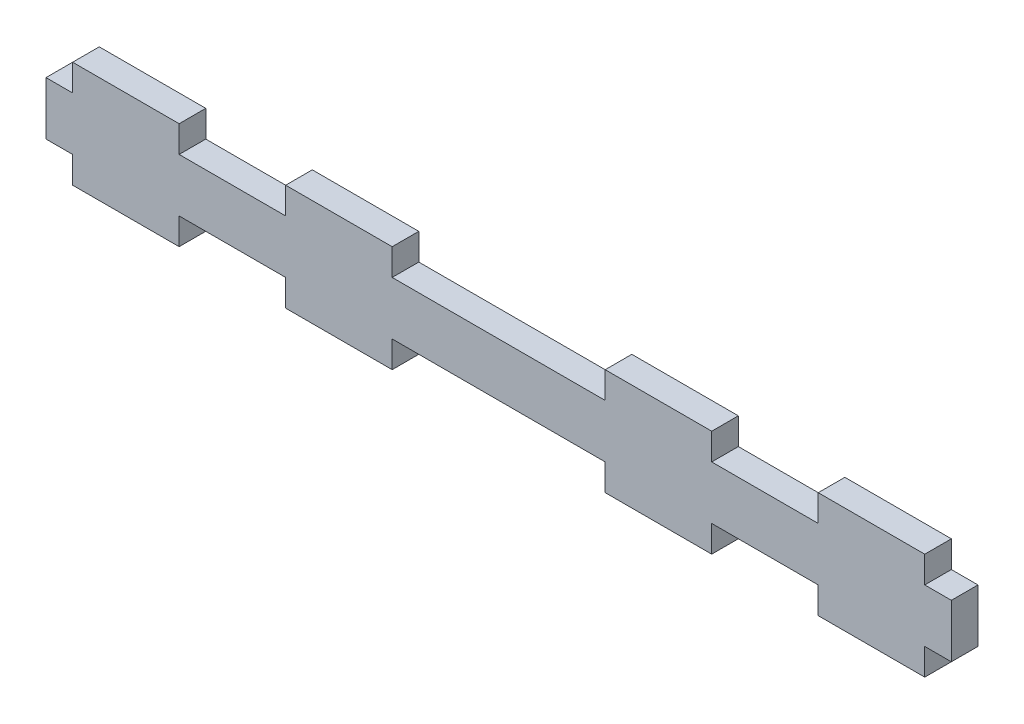
ISO-10303-21;
HEADER;
FILE_DESCRIPTION(('STEP AP214'),'2;1');
FILE_NAME('part.step','',(''),(''),'','','');
FILE_SCHEMA(('AUTOMOTIVE_DESIGN { 1 0 10303 214 1 1 1 1 }'));
ENDSEC;
DATA;
#1=APPLICATION_CONTEXT('core data for automotive mechanical design processes');
#2=APPLICATION_PROTOCOL_DEFINITION('international standard','automotive_design',2000,#1);
#3=PRODUCT_CONTEXT('',#1,'mechanical');
#4=PRODUCT('Part','Part','',(#3));
#5=PRODUCT_RELATED_PRODUCT_CATEGORY('part','',(#4));
#6=PRODUCT_DEFINITION_FORMATION('','',#4);
#7=PRODUCT_DEFINITION_CONTEXT('part definition',#1,'design');
#8=PRODUCT_DEFINITION('design','',#6,#7);
#9=PRODUCT_DEFINITION_SHAPE('','',#8);
#10=(LENGTH_UNIT() NAMED_UNIT(*) SI_UNIT(.MILLI.,.METRE.));
#11=(NAMED_UNIT(*) PLANE_ANGLE_UNIT() SI_UNIT($,.RADIAN.));
#12=(NAMED_UNIT(*) SI_UNIT($,.STERADIAN.) SOLID_ANGLE_UNIT());
#13=UNCERTAINTY_MEASURE_WITH_UNIT(LENGTH_MEASURE(1.E-05),#10,'distance_accuracy_value','');
#14=(GEOMETRIC_REPRESENTATION_CONTEXT(3) GLOBAL_UNCERTAINTY_ASSIGNED_CONTEXT((#13)) GLOBAL_UNIT_ASSIGNED_CONTEXT((#10,
#11,#12)) REPRESENTATION_CONTEXT('',''));
#15=CARTESIAN_POINT('',(0.,0.,0.));
#16=DIRECTION('',(0.,0.,1.));
#17=DIRECTION('',(1.,0.,0.));
#18=AXIS2_PLACEMENT_3D('',#15,#16,#17);
#19=CARTESIAN_POINT('',(42.5000000000001,2.5,2.5));
#20=DIRECTION('',(0.,-1.,0.));
#21=DIRECTION('',(0.,0.,-1.));
#22=AXIS2_PLACEMENT_3D('',#19,#20,#21);
#23=PLANE('',#22);
#24=DIRECTION('',(-1.,0.,0.));
#25=VECTOR('',#24,1.);
#26=CARTESIAN_POINT('',(42.5000000000001,2.5,0.));
#27=LINE('',#26,#25);
#28=CARTESIAN_POINT('',(42.5000000000001,2.5,0.));
#29=VERTEX_POINT('',#28);
#30=CARTESIAN_POINT('',(39.9999999999999,2.5,0.));
#31=VERTEX_POINT('',#30);
#32=EDGE_CURVE('E297',#29,#31,#27,.T.);
#33=ORIENTED_EDGE('',*,*,#32,.T.);
#34=DIRECTION('',(0.,0.,-1.));
#35=VECTOR('',#34,1.);
#36=CARTESIAN_POINT('',(39.9999999999999,2.5,2.5));
#37=LINE('',#36,#35);
#38=CARTESIAN_POINT('',(39.9999999999999,2.5,2.5));
#39=VERTEX_POINT('',#38);
#40=EDGE_CURVE('E11',#39,#31,#37,.T.);
#41=ORIENTED_EDGE('',*,*,#40,.F.);
#42=DIRECTION('',(-1.,0.,0.));
#43=VECTOR('',#42,1.);
#44=CARTESIAN_POINT('',(42.5000000000001,2.5,2.5));
#45=LINE('',#44,#43);
#46=CARTESIAN_POINT('',(42.5000000000001,2.5,2.5));
#47=VERTEX_POINT('',#46);
#48=EDGE_CURVE('E367',#47,#39,#45,.T.);
#49=ORIENTED_EDGE('',*,*,#48,.F.);
#50=DIRECTION('',(0.,0.,-1.));
#51=VECTOR('',#50,1.);
#52=CARTESIAN_POINT('',(42.5000000000001,2.5,2.5));
#53=LINE('',#52,#51);
#54=EDGE_CURVE('E293',#47,#29,#53,.T.);
#55=ORIENTED_EDGE('',*,*,#54,.T.);
#56=EDGE_LOOP('',(#33,#41,#49,#55));
#57=FACE_BOUND('',#56,.T.);
#58=ADVANCED_FACE('F33',(#57),#23,.F.);
#59=CARTESIAN_POINT('',(39.9999999999999,2.5,2.5));
#60=DIRECTION('',(-1.,0.,0.));
#61=DIRECTION('',(0.,-1.,0.));
#62=AXIS2_PLACEMENT_3D('',#59,#60,#61);
#63=PLANE('',#62);
#64=DIRECTION('',(0.,1.,0.));
#65=VECTOR('',#64,1.);
#66=CARTESIAN_POINT('',(39.9999999999999,2.5,0.));
#67=LINE('',#66,#65);
#68=CARTESIAN_POINT('',(40.0000000000001,5.,0.));
#69=VERTEX_POINT('',#68);
#70=EDGE_CURVE('E300',#31,#69,#67,.T.);
#71=ORIENTED_EDGE('',*,*,#70,.T.);
#72=DIRECTION('',(0.,0.,-1.));
#73=VECTOR('',#72,1.);
#74=CARTESIAN_POINT('',(40.0000000000001,5.,2.5));
#75=LINE('',#74,#73);
#76=CARTESIAN_POINT('',(40.0000000000001,5.,2.5));
#77=VERTEX_POINT('',#76);
#78=EDGE_CURVE('E41',#77,#69,#75,.T.);
#79=ORIENTED_EDGE('',*,*,#78,.F.);
#80=DIRECTION('',(0.,1.,0.));
#81=VECTOR('',#80,1.);
#82=CARTESIAN_POINT('',(39.9999999999999,2.5,2.5));
#83=LINE('',#82,#81);
#84=EDGE_CURVE('E176',#39,#77,#83,.T.);
#85=ORIENTED_EDGE('',*,*,#84,.F.);
#86=ORIENTED_EDGE('',*,*,#40,.T.);
#87=EDGE_LOOP('',(#71,#79,#85,#86));
#88=FACE_BOUND('',#87,.T.);
#89=ADVANCED_FACE('F565',(#88),#63,.F.);
#90=CARTESIAN_POINT('',(40.0000000000001,5.,2.5));
#91=DIRECTION('',(0.,-1.,0.));
#92=DIRECTION('',(1.,0.,0.));
#93=AXIS2_PLACEMENT_3D('',#90,#91,#92);
#94=PLANE('',#93);
#95=DIRECTION('',(-1.,0.,0.));
#96=VECTOR('',#95,1.);
#97=CARTESIAN_POINT('',(40.0000000000001,5.,0.));
#98=LINE('',#97,#96);
#99=CARTESIAN_POINT('',(30.0000000000001,5.,0.));
#100=VERTEX_POINT('',#99);
#101=EDGE_CURVE('E302',#69,#100,#98,.T.);
#102=ORIENTED_EDGE('',*,*,#101,.T.);
#103=DIRECTION('',(0.,0.,-1.));
#104=VECTOR('',#103,1.);
#105=CARTESIAN_POINT('',(30.0000000000001,5.,2.5));
#106=LINE('',#105,#104);
#107=CARTESIAN_POINT('',(30.0000000000001,5.,2.5));
#108=VERTEX_POINT('',#107);
#109=EDGE_CURVE('E458',#108,#100,#106,.T.);
#110=ORIENTED_EDGE('',*,*,#109,.F.);
#111=DIRECTION('',(-1.,0.,0.));
#112=VECTOR('',#111,1.);
#113=CARTESIAN_POINT('',(40.0000000000001,5.,2.5));
#114=LINE('',#113,#112);
#115=EDGE_CURVE('E466',#77,#108,#114,.T.);
#116=ORIENTED_EDGE('',*,*,#115,.F.);
#117=ORIENTED_EDGE('',*,*,#78,.T.);
#118=EDGE_LOOP('',(#102,#110,#116,#117));
#119=FACE_BOUND('',#118,.T.);
#120=ADVANCED_FACE('F464',(#119),#94,.F.);
#121=CARTESIAN_POINT('',(30.0000000000001,5.,2.5));
#122=DIRECTION('',(1.,0.,0.));
#123=DIRECTION('',(0.,0.,-1.));
#124=AXIS2_PLACEMENT_3D('',#121,#122,#123);
#125=PLANE('',#124);
#126=DIRECTION('',(0.,-1.,0.));
#127=VECTOR('',#126,1.);
#128=CARTESIAN_POINT('',(30.0000000000001,5.,0.));
#129=LINE('',#128,#127);
#130=CARTESIAN_POINT('',(30.0000000000001,2.5,0.));
#131=VERTEX_POINT('',#130);
#132=EDGE_CURVE('E304',#100,#131,#129,.T.);
#133=ORIENTED_EDGE('',*,*,#132,.T.);
#134=DIRECTION('',(0.,0.,-1.));
#135=VECTOR('',#134,1.);
#136=CARTESIAN_POINT('',(30.0000000000001,2.5,2.5));
#137=LINE('',#136,#135);
#138=CARTESIAN_POINT('',(30.0000000000001,2.5,2.5));
#139=VERTEX_POINT('',#138);
#140=EDGE_CURVE('E455',#139,#131,#137,.T.);
#141=ORIENTED_EDGE('',*,*,#140,.F.);
#142=DIRECTION('',(0.,-1.,0.));
#143=VECTOR('',#142,1.);
#144=CARTESIAN_POINT('',(30.0000000000001,5.,2.5));
#145=LINE('',#144,#143);
#146=EDGE_CURVE('E484',#108,#139,#145,.T.);
#147=ORIENTED_EDGE('',*,*,#146,.F.);
#148=ORIENTED_EDGE('',*,*,#109,.T.);
#149=EDGE_LOOP('',(#133,#141,#147,#148));
#150=FACE_BOUND('',#149,.T.);
#151=ADVANCED_FACE('F475',(#150),#125,.F.);
#152=CARTESIAN_POINT('',(30.0000000000001,2.5,2.5));
#153=DIRECTION('',(0.,-1.,0.));
#154=DIRECTION('',(1.,0.,0.));
#155=AXIS2_PLACEMENT_3D('',#152,#153,#154);
#156=PLANE('',#155);
#157=DIRECTION('',(-1.,0.,0.));
#158=VECTOR('',#157,1.);
#159=CARTESIAN_POINT('',(30.0000000000001,2.5,0.));
#160=LINE('',#159,#158);
#161=CARTESIAN_POINT('',(20.0000000000001,2.5,0.));
#162=VERTEX_POINT('',#161);
#163=EDGE_CURVE('E306',#131,#162,#160,.T.);
#164=ORIENTED_EDGE('',*,*,#163,.T.);
#165=DIRECTION('',(0.,0.,-1.));
#166=VECTOR('',#165,1.);
#167=CARTESIAN_POINT('',(20.0000000000001,2.5,2.5));
#168=LINE('',#167,#166);
#169=CARTESIAN_POINT('',(20.0000000000001,2.5,2.5));
#170=VERTEX_POINT('',#169);
#171=EDGE_CURVE('E452',#170,#162,#168,.T.);
#172=ORIENTED_EDGE('',*,*,#171,.F.);
#173=DIRECTION('',(-1.,0.,0.));
#174=VECTOR('',#173,1.);
#175=CARTESIAN_POINT('',(30.0000000000001,2.5,2.5));
#176=LINE('',#175,#174);
#177=EDGE_CURVE('E481',#139,#170,#176,.T.);
#178=ORIENTED_EDGE('',*,*,#177,.F.);
#179=ORIENTED_EDGE('',*,*,#140,.T.);
#180=EDGE_LOOP('',(#164,#172,#178,#179));
#181=FACE_BOUND('',#180,.T.);
#182=ADVANCED_FACE('F479',(#181),#156,.F.);
#183=CARTESIAN_POINT('',(20.0000000000001,2.5,2.5));
#184=DIRECTION('',(-1.,0.,0.));
#185=DIRECTION('',(0.,0.,1.));
#186=AXIS2_PLACEMENT_3D('',#183,#184,#185);
#187=PLANE('',#186);
#188=DIRECTION('',(0.,1.,0.));
#189=VECTOR('',#188,1.);
#190=CARTESIAN_POINT('',(20.0000000000001,2.5,0.));
#191=LINE('',#190,#189);
#192=CARTESIAN_POINT('',(20.0000000000001,5.,0.));
#193=VERTEX_POINT('',#192);
#194=EDGE_CURVE('E308',#162,#193,#191,.T.);
#195=ORIENTED_EDGE('',*,*,#194,.T.);
#196=DIRECTION('',(0.,0.,-1.));
#197=VECTOR('',#196,1.);
#198=CARTESIAN_POINT('',(20.0000000000001,5.,2.5));
#199=LINE('',#198,#197);
#200=CARTESIAN_POINT('',(20.0000000000001,5.,2.5));
#201=VERTEX_POINT('',#200);
#202=EDGE_CURVE('E449',#201,#193,#199,.T.);
#203=ORIENTED_EDGE('',*,*,#202,.F.);
#204=DIRECTION('',(0.,1.,0.));
#205=VECTOR('',#204,1.);
#206=CARTESIAN_POINT('',(20.0000000000001,2.5,2.5));
#207=LINE('',#206,#205);
#208=EDGE_CURVE('E483',#170,#201,#207,.T.);
#209=ORIENTED_EDGE('',*,*,#208,.F.);
#210=ORIENTED_EDGE('',*,*,#171,.T.);
#211=EDGE_LOOP('',(#195,#203,#209,#210));
#212=FACE_BOUND('',#211,.T.);
#213=ADVANCED_FACE('F578',(#212),#187,.F.);
#214=CARTESIAN_POINT('',(20.0000000000001,5.,2.5));
#215=DIRECTION('',(0.,-1.,0.));
#216=DIRECTION('',(0.,0.,-1.));
#217=AXIS2_PLACEMENT_3D('',#214,#215,#216);
#218=PLANE('',#217);
#219=DIRECTION('',(-1.,0.,0.));
#220=VECTOR('',#219,1.);
#221=CARTESIAN_POINT('',(20.0000000000001,5.,0.));
#222=LINE('',#221,#220);
#223=CARTESIAN_POINT('',(10.0000000000001,5.,0.));
#224=VERTEX_POINT('',#223);
#225=EDGE_CURVE('E310',#193,#224,#222,.T.);
#226=ORIENTED_EDGE('',*,*,#225,.T.);
#227=DIRECTION('',(0.,0.,-1.));
#228=VECTOR('',#227,1.);
#229=CARTESIAN_POINT('',(10.0000000000001,5.,2.5));
#230=LINE('',#229,#228);
#231=CARTESIAN_POINT('',(10.0000000000001,5.,2.5));
#232=VERTEX_POINT('',#231);
#233=EDGE_CURVE('E446',#232,#224,#230,.T.);
#234=ORIENTED_EDGE('',*,*,#233,.F.);
#235=DIRECTION('',(-1.,0.,0.));
#236=VECTOR('',#235,1.);
#237=CARTESIAN_POINT('',(20.0000000000001,5.,2.5));
#238=LINE('',#237,#236);
#239=EDGE_CURVE('E486',#201,#232,#238,.T.);
#240=ORIENTED_EDGE('',*,*,#239,.F.);
#241=ORIENTED_EDGE('',*,*,#202,.T.);
#242=EDGE_LOOP('',(#226,#234,#240,#241));
#243=FACE_BOUND('',#242,.T.);
#244=ADVANCED_FACE('F581',(#243),#218,.F.);
#245=CARTESIAN_POINT('',(10.0000000000001,5.,2.5));
#246=DIRECTION('',(1.,0.,0.));
#247=DIRECTION('',(0.,0.,-1.));
#248=AXIS2_PLACEMENT_3D('',#245,#246,#247);
#249=PLANE('',#248);
#250=DIRECTION('',(0.,-1.,0.));
#251=VECTOR('',#250,1.);
#252=CARTESIAN_POINT('',(10.0000000000001,5.,0.));
#253=LINE('',#252,#251);
#254=CARTESIAN_POINT('',(10.0000000000001,2.5,0.));
#255=VERTEX_POINT('',#254);
#256=EDGE_CURVE('E312',#224,#255,#253,.T.);
#257=ORIENTED_EDGE('',*,*,#256,.T.);
#258=DIRECTION('',(0.,0.,-1.));
#259=VECTOR('',#258,1.);
#260=CARTESIAN_POINT('',(10.0000000000001,2.5,2.5));
#261=LINE('',#260,#259);
#262=CARTESIAN_POINT('',(10.0000000000001,2.5,2.5));
#263=VERTEX_POINT('',#262);
#264=EDGE_CURVE('E443',#263,#255,#261,.T.);
#265=ORIENTED_EDGE('',*,*,#264,.F.);
#266=DIRECTION('',(0.,-1.,0.));
#267=VECTOR('',#266,1.);
#268=CARTESIAN_POINT('',(10.0000000000001,5.,2.5));
#269=LINE('',#268,#267);
#270=EDGE_CURVE('E492',#232,#263,#269,.T.);
#271=ORIENTED_EDGE('',*,*,#270,.F.);
#272=ORIENTED_EDGE('',*,*,#233,.T.);
#273=EDGE_LOOP('',(#257,#265,#271,#272));
#274=FACE_BOUND('',#273,.T.);
#275=ADVANCED_FACE('F585',(#274),#249,.F.);
#276=CARTESIAN_POINT('',(-10.0000000000001,2.5,2.5));
#277=DIRECTION('',(0.,-1.,0.));
#278=DIRECTION('',(0.,0.,-1.));
#279=AXIS2_PLACEMENT_3D('',#276,#277,#278);
#280=PLANE('',#279);
#281=DIRECTION('',(-1.,0.,0.));
#282=VECTOR('',#281,1.);
#283=CARTESIAN_POINT('',(-10.0000000000001,2.5,0.));
#284=LINE('',#283,#282);
#285=CARTESIAN_POINT('',(-10.0000000000001,2.5,0.));
#286=VERTEX_POINT('',#285);
#287=EDGE_CURVE('E314',#255,#286,#284,.T.);
#288=ORIENTED_EDGE('',*,*,#287,.T.);
#289=DIRECTION('',(0.,0.,-1.));
#290=VECTOR('',#289,1.);
#291=CARTESIAN_POINT('',(-10.0000000000001,2.5,2.5));
#292=LINE('',#291,#290);
#293=CARTESIAN_POINT('',(-10.0000000000001,2.5,2.5));
#294=VERTEX_POINT('',#293);
#295=EDGE_CURVE('E440',#294,#286,#292,.T.);
#296=ORIENTED_EDGE('',*,*,#295,.F.);
#297=DIRECTION('',(-1.,0.,0.));
#298=VECTOR('',#297,1.);
#299=CARTESIAN_POINT('',(-10.0000000000001,2.5,2.5));
#300=LINE('',#299,#298);
#301=EDGE_CURVE('E494',#263,#294,#300,.T.);
#302=ORIENTED_EDGE('',*,*,#301,.F.);
#303=ORIENTED_EDGE('',*,*,#264,.T.);
#304=EDGE_LOOP('',(#288,#296,#302,#303));
#305=FACE_BOUND('',#304,.T.);
#306=ADVANCED_FACE('F589',(#305),#280,.F.);
#307=CARTESIAN_POINT('',(-10.0000000000001,5.,2.5));
#308=DIRECTION('',(-1.,0.,0.));
#309=DIRECTION('',(0.,0.,1.));
#310=AXIS2_PLACEMENT_3D('',#307,#308,#309);
#311=PLANE('',#310);
#312=DIRECTION('',(0.,1.,0.));
#313=VECTOR('',#312,1.);
#314=CARTESIAN_POINT('',(-10.0000000000001,5.,0.));
#315=LINE('',#314,#313);
#316=CARTESIAN_POINT('',(-10.0000000000001,5.,0.));
#317=VERTEX_POINT('',#316);
#318=EDGE_CURVE('E316',#286,#317,#315,.T.);
#319=ORIENTED_EDGE('',*,*,#318,.T.);
#320=DIRECTION('',(0.,0.,-1.));
#321=VECTOR('',#320,1.);
#322=CARTESIAN_POINT('',(-10.0000000000001,5.,2.5));
#323=LINE('',#322,#321);
#324=CARTESIAN_POINT('',(-10.0000000000001,5.,2.5));
#325=VERTEX_POINT('',#324);
#326=EDGE_CURVE('E437',#325,#317,#323,.T.);
#327=ORIENTED_EDGE('',*,*,#326,.F.);
#328=DIRECTION('',(0.,1.,0.));
#329=VECTOR('',#328,1.);
#330=CARTESIAN_POINT('',(-10.0000000000001,5.,2.5));
#331=LINE('',#330,#329);
#332=EDGE_CURVE('E496',#294,#325,#331,.T.);
#333=ORIENTED_EDGE('',*,*,#332,.F.);
#334=ORIENTED_EDGE('',*,*,#295,.T.);
#335=EDGE_LOOP('',(#319,#327,#333,#334));
#336=FACE_BOUND('',#335,.T.);
#337=ADVANCED_FACE('F593',(#336),#311,.F.);
#338=CARTESIAN_POINT('',(-20.0000000000001,5.,2.5));
#339=DIRECTION('',(0.,-1.,0.));
#340=DIRECTION('',(0.,0.,-1.));
#341=AXIS2_PLACEMENT_3D('',#338,#339,#340);
#342=PLANE('',#341);
#343=DIRECTION('',(-1.,0.,0.));
#344=VECTOR('',#343,1.);
#345=CARTESIAN_POINT('',(-20.0000000000001,5.,0.));
#346=LINE('',#345,#344);
#347=CARTESIAN_POINT('',(-20.0000000000001,5.,0.));
#348=VERTEX_POINT('',#347);
#349=EDGE_CURVE('E318',#317,#348,#346,.T.);
#350=ORIENTED_EDGE('',*,*,#349,.T.);
#351=DIRECTION('',(0.,0.,-1.));
#352=VECTOR('',#351,1.);
#353=CARTESIAN_POINT('',(-20.0000000000001,5.,2.5));
#354=LINE('',#353,#352);
#355=CARTESIAN_POINT('',(-20.0000000000001,5.,2.5));
#356=VERTEX_POINT('',#355);
#357=EDGE_CURVE('E434',#356,#348,#354,.T.);
#358=ORIENTED_EDGE('',*,*,#357,.F.);
#359=DIRECTION('',(-1.,0.,0.));
#360=VECTOR('',#359,1.);
#361=CARTESIAN_POINT('',(-20.0000000000001,5.,2.5));
#362=LINE('',#361,#360);
#363=EDGE_CURVE('E498',#325,#356,#362,.T.);
#364=ORIENTED_EDGE('',*,*,#363,.F.);
#365=ORIENTED_EDGE('',*,*,#326,.T.);
#366=EDGE_LOOP('',(#350,#358,#364,#365));
#367=FACE_BOUND('',#366,.T.);
#368=ADVANCED_FACE('F597',(#367),#342,.F.);
#369=CARTESIAN_POINT('',(-20.0000000000001,2.5,2.5));
#370=DIRECTION('',(1.,0.,0.));
#371=DIRECTION('',(0.,0.,-1.));
#372=AXIS2_PLACEMENT_3D('',#369,#370,#371);
#373=PLANE('',#372);
#374=DIRECTION('',(0.,-1.,0.));
#375=VECTOR('',#374,1.);
#376=CARTESIAN_POINT('',(-20.0000000000001,2.5,0.));
#377=LINE('',#376,#375);
#378=CARTESIAN_POINT('',(-20.0000000000001,2.5,0.));
#379=VERTEX_POINT('',#378);
#380=EDGE_CURVE('E320',#348,#379,#377,.T.);
#381=ORIENTED_EDGE('',*,*,#380,.T.);
#382=DIRECTION('',(0.,0.,-1.));
#383=VECTOR('',#382,1.);
#384=CARTESIAN_POINT('',(-20.0000000000001,2.5,2.5));
#385=LINE('',#384,#383);
#386=CARTESIAN_POINT('',(-20.0000000000001,2.5,2.5));
#387=VERTEX_POINT('',#386);
#388=EDGE_CURVE('E431',#387,#379,#385,.T.);
#389=ORIENTED_EDGE('',*,*,#388,.F.);
#390=DIRECTION('',(0.,-1.,0.));
#391=VECTOR('',#390,1.);
#392=CARTESIAN_POINT('',(-20.0000000000001,2.5,2.5));
#393=LINE('',#392,#391);
#394=EDGE_CURVE('E500',#356,#387,#393,.T.);
#395=ORIENTED_EDGE('',*,*,#394,.F.);
#396=ORIENTED_EDGE('',*,*,#357,.T.);
#397=EDGE_LOOP('',(#381,#389,#395,#396));
#398=FACE_BOUND('',#397,.T.);
#399=ADVANCED_FACE('F601',(#398),#373,.F.);
#400=CARTESIAN_POINT('',(-30.0000000000001,2.5,2.5));
#401=DIRECTION('',(0.,-1.,0.));
#402=DIRECTION('',(1.,0.,0.));
#403=AXIS2_PLACEMENT_3D('',#400,#401,#402);
#404=PLANE('',#403);
#405=DIRECTION('',(-1.,0.,0.));
#406=VECTOR('',#405,1.);
#407=CARTESIAN_POINT('',(-30.0000000000001,2.5,0.));
#408=LINE('',#407,#406);
#409=CARTESIAN_POINT('',(-30.0000000000001,2.5,0.));
#410=VERTEX_POINT('',#409);
#411=EDGE_CURVE('E322',#379,#410,#408,.T.);
#412=ORIENTED_EDGE('',*,*,#411,.T.);
#413=DIRECTION('',(0.,0.,-1.));
#414=VECTOR('',#413,1.);
#415=CARTESIAN_POINT('',(-30.0000000000001,2.5,2.5));
#416=LINE('',#415,#414);
#417=CARTESIAN_POINT('',(-30.0000000000001,2.5,2.5));
#418=VERTEX_POINT('',#417);
#419=EDGE_CURVE('E428',#418,#410,#416,.T.);
#420=ORIENTED_EDGE('',*,*,#419,.F.);
#421=DIRECTION('',(-1.,0.,0.));
#422=VECTOR('',#421,1.);
#423=CARTESIAN_POINT('',(-30.0000000000001,2.5,2.5));
#424=LINE('',#423,#422);
#425=EDGE_CURVE('E502',#387,#418,#424,.T.);
#426=ORIENTED_EDGE('',*,*,#425,.F.);
#427=ORIENTED_EDGE('',*,*,#388,.T.);
#428=EDGE_LOOP('',(#412,#420,#426,#427));
#429=FACE_BOUND('',#428,.T.);
#430=ADVANCED_FACE('F605',(#429),#404,.F.);
#431=CARTESIAN_POINT('',(-30.0000000000001,5.,2.5));
#432=DIRECTION('',(-1.,0.,0.));
#433=DIRECTION('',(0.,0.,1.));
#434=AXIS2_PLACEMENT_3D('',#431,#432,#433);
#435=PLANE('',#434);
#436=DIRECTION('',(0.,1.,0.));
#437=VECTOR('',#436,1.);
#438=CARTESIAN_POINT('',(-30.0000000000001,5.,0.));
#439=LINE('',#438,#437);
#440=CARTESIAN_POINT('',(-30.0000000000001,5.,0.));
#441=VERTEX_POINT('',#440);
#442=EDGE_CURVE('E324',#410,#441,#439,.T.);
#443=ORIENTED_EDGE('',*,*,#442,.T.);
#444=DIRECTION('',(0.,0.,-1.));
#445=VECTOR('',#444,1.);
#446=CARTESIAN_POINT('',(-30.0000000000001,5.,2.5));
#447=LINE('',#446,#445);
#448=CARTESIAN_POINT('',(-30.0000000000001,5.,2.5));
#449=VERTEX_POINT('',#448);
#450=EDGE_CURVE('E425',#449,#441,#447,.T.);
#451=ORIENTED_EDGE('',*,*,#450,.F.);
#452=DIRECTION('',(0.,1.,0.));
#453=VECTOR('',#452,1.);
#454=CARTESIAN_POINT('',(-30.0000000000001,5.,2.5));
#455=LINE('',#454,#453);
#456=EDGE_CURVE('E504',#418,#449,#455,.T.);
#457=ORIENTED_EDGE('',*,*,#456,.F.);
#458=ORIENTED_EDGE('',*,*,#419,.T.);
#459=EDGE_LOOP('',(#443,#451,#457,#458));
#460=FACE_BOUND('',#459,.T.);
#461=ADVANCED_FACE('F609',(#460),#435,.F.);
#462=CARTESIAN_POINT('',(-40.0000000000001,5.,2.5));
#463=DIRECTION('',(0.,-1.,0.));
#464=DIRECTION('',(1.,0.,0.));
#465=AXIS2_PLACEMENT_3D('',#462,#463,#464);
#466=PLANE('',#465);
#467=DIRECTION('',(-1.,0.,0.));
#468=VECTOR('',#467,1.);
#469=CARTESIAN_POINT('',(-40.0000000000001,5.,0.));
#470=LINE('',#469,#468);
#471=CARTESIAN_POINT('',(-40.0000000000001,5.,0.));
#472=VERTEX_POINT('',#471);
#473=EDGE_CURVE('E326',#441,#472,#470,.T.);
#474=ORIENTED_EDGE('',*,*,#473,.T.);
#475=DIRECTION('',(0.,0.,-1.));
#476=VECTOR('',#475,1.);
#477=CARTESIAN_POINT('',(-40.0000000000001,5.,2.5));
#478=LINE('',#477,#476);
#479=CARTESIAN_POINT('',(-40.0000000000001,5.,2.5));
#480=VERTEX_POINT('',#479);
#481=EDGE_CURVE('E422',#480,#472,#478,.T.);
#482=ORIENTED_EDGE('',*,*,#481,.F.);
#483=DIRECTION('',(-1.,0.,0.));
#484=VECTOR('',#483,1.);
#485=CARTESIAN_POINT('',(-40.0000000000001,5.,2.5));
#486=LINE('',#485,#484);
#487=EDGE_CURVE('E506',#449,#480,#486,.T.);
#488=ORIENTED_EDGE('',*,*,#487,.F.);
#489=ORIENTED_EDGE('',*,*,#450,.T.);
#490=EDGE_LOOP('',(#474,#482,#488,#489));
#491=FACE_BOUND('',#490,.T.);
#492=ADVANCED_FACE('F613',(#491),#466,.F.);
#493=CARTESIAN_POINT('',(-40.0000000000001,2.5,2.5));
#494=DIRECTION('',(1.,0.,0.));
#495=DIRECTION('',(0.,0.,-1.));
#496=AXIS2_PLACEMENT_3D('',#493,#494,#495);
#497=PLANE('',#496);
#498=DIRECTION('',(0.,-1.,0.));
#499=VECTOR('',#498,1.);
#500=CARTESIAN_POINT('',(-40.0000000000001,2.5,0.));
#501=LINE('',#500,#499);
#502=CARTESIAN_POINT('',(-40.0000000000001,2.5,0.));
#503=VERTEX_POINT('',#502);
#504=EDGE_CURVE('E328',#472,#503,#501,.T.);
#505=ORIENTED_EDGE('',*,*,#504,.T.);
#506=DIRECTION('',(0.,0.,-1.));
#507=VECTOR('',#506,1.);
#508=CARTESIAN_POINT('',(-40.0000000000001,2.5,2.5));
#509=LINE('',#508,#507);
#510=CARTESIAN_POINT('',(-40.0000000000001,2.5,2.5));
#511=VERTEX_POINT('',#510);
#512=EDGE_CURVE('E419',#511,#503,#509,.T.);
#513=ORIENTED_EDGE('',*,*,#512,.F.);
#514=DIRECTION('',(0.,-1.,0.));
#515=VECTOR('',#514,1.);
#516=CARTESIAN_POINT('',(-40.0000000000001,2.5,2.5));
#517=LINE('',#516,#515);
#518=EDGE_CURVE('E508',#480,#511,#517,.T.);
#519=ORIENTED_EDGE('',*,*,#518,.F.);
#520=ORIENTED_EDGE('',*,*,#481,.T.);
#521=EDGE_LOOP('',(#505,#513,#519,#520));
#522=FACE_BOUND('',#521,.T.);
#523=ADVANCED_FACE('F617',(#522),#497,.F.);
#524=CARTESIAN_POINT('',(-42.5000000000001,2.5,2.5));
#525=DIRECTION('',(0.,-1.,0.));
#526=DIRECTION('',(0.,0.,-1.));
#527=AXIS2_PLACEMENT_3D('',#524,#525,#526);
#528=PLANE('',#527);
#529=DIRECTION('',(-1.,0.,0.));
#530=VECTOR('',#529,1.);
#531=CARTESIAN_POINT('',(-42.5000000000001,2.5,0.));
#532=LINE('',#531,#530);
#533=CARTESIAN_POINT('',(-42.5000000000001,2.5,0.));
#534=VERTEX_POINT('',#533);
#535=EDGE_CURVE('E330',#503,#534,#532,.T.);
#536=ORIENTED_EDGE('',*,*,#535,.T.);
#537=DIRECTION('',(0.,0.,-1.));
#538=VECTOR('',#537,1.);
#539=CARTESIAN_POINT('',(-42.5000000000001,2.5,2.5));
#540=LINE('',#539,#538);
#541=CARTESIAN_POINT('',(-42.5000000000001,2.5,2.5));
#542=VERTEX_POINT('',#541);
#543=EDGE_CURVE('E416',#542,#534,#540,.T.);
#544=ORIENTED_EDGE('',*,*,#543,.F.);
#545=DIRECTION('',(-1.,0.,0.));
#546=VECTOR('',#545,1.);
#547=CARTESIAN_POINT('',(-42.5000000000001,2.5,2.5));
#548=LINE('',#547,#546);
#549=EDGE_CURVE('E510',#511,#542,#548,.T.);
#550=ORIENTED_EDGE('',*,*,#549,.F.);
#551=ORIENTED_EDGE('',*,*,#512,.T.);
#552=EDGE_LOOP('',(#536,#544,#550,#551));
#553=FACE_BOUND('',#552,.T.);
#554=ADVANCED_FACE('F621',(#553),#528,.F.);
#555=CARTESIAN_POINT('',(-42.5000000000001,2.5,2.5));
#556=DIRECTION('',(1.,0.,0.));
#557=DIRECTION('',(0.,1.,0.));
#558=AXIS2_PLACEMENT_3D('',#555,#556,#557);
#559=PLANE('',#558);
#560=DIRECTION('',(0.,-1.,0.));
#561=VECTOR('',#560,1.);
#562=CARTESIAN_POINT('',(-42.5000000000001,2.5,0.));
#563=LINE('',#562,#561);
#564=CARTESIAN_POINT('',(-42.5,-2.5,0.));
#565=VERTEX_POINT('',#564);
#566=EDGE_CURVE('E332',#534,#565,#563,.T.);
#567=ORIENTED_EDGE('',*,*,#566,.T.);
#568=DIRECTION('',(0.,0.,-1.));
#569=VECTOR('',#568,1.);
#570=CARTESIAN_POINT('',(-42.5,-2.5,2.5));
#571=LINE('',#570,#569);
#572=CARTESIAN_POINT('',(-42.5,-2.5,2.5));
#573=VERTEX_POINT('',#572);
#574=EDGE_CURVE('E413',#573,#565,#571,.T.);
#575=ORIENTED_EDGE('',*,*,#574,.F.);
#576=DIRECTION('',(0.,-1.,0.));
#577=VECTOR('',#576,1.);
#578=CARTESIAN_POINT('',(-42.5000000000001,2.5,2.5));
#579=LINE('',#578,#577);
#580=EDGE_CURVE('E512',#542,#573,#579,.T.);
#581=ORIENTED_EDGE('',*,*,#580,.F.);
#582=ORIENTED_EDGE('',*,*,#543,.T.);
#583=EDGE_LOOP('',(#567,#575,#581,#582));
#584=FACE_BOUND('',#583,.T.);
#585=ADVANCED_FACE('F625',(#584),#559,.F.);
#586=CARTESIAN_POINT('',(-42.5,-2.5,2.5));
#587=DIRECTION('',(0.,1.,0.));
#588=DIRECTION('',(0.,0.,1.));
#589=AXIS2_PLACEMENT_3D('',#586,#587,#588);
#590=PLANE('',#589);
#591=DIRECTION('',(1.,0.,0.));
#592=VECTOR('',#591,1.);
#593=CARTESIAN_POINT('',(-42.5,-2.5,0.));
#594=LINE('',#593,#592);
#595=CARTESIAN_POINT('',(-40.0000000000001,-2.5,0.));
#596=VERTEX_POINT('',#595);
#597=EDGE_CURVE('E334',#565,#596,#594,.T.);
#598=ORIENTED_EDGE('',*,*,#597,.T.);
#599=DIRECTION('',(0.,0.,-1.));
#600=VECTOR('',#599,1.);
#601=CARTESIAN_POINT('',(-40.0000000000001,-2.5,2.5));
#602=LINE('',#601,#600);
#603=CARTESIAN_POINT('',(-40.0000000000001,-2.5,2.5));
#604=VERTEX_POINT('',#603);
#605=EDGE_CURVE('E410',#604,#596,#602,.T.);
#606=ORIENTED_EDGE('',*,*,#605,.F.);
#607=DIRECTION('',(1.,0.,0.));
#608=VECTOR('',#607,1.);
#609=CARTESIAN_POINT('',(-42.5,-2.5,2.5));
#610=LINE('',#609,#608);
#611=EDGE_CURVE('E514',#573,#604,#610,.T.);
#612=ORIENTED_EDGE('',*,*,#611,.F.);
#613=ORIENTED_EDGE('',*,*,#574,.T.);
#614=EDGE_LOOP('',(#598,#606,#612,#613));
#615=FACE_BOUND('',#614,.T.);
#616=ADVANCED_FACE('F629',(#615),#590,.F.);
#617=CARTESIAN_POINT('',(-40.0000000000001,-2.5,2.5));
#618=DIRECTION('',(1.,0.,0.));
#619=DIRECTION('',(0.,1.,0.));
#620=AXIS2_PLACEMENT_3D('',#617,#618,#619);
#621=PLANE('',#620);
#622=DIRECTION('',(0.,-1.,0.));
#623=VECTOR('',#622,1.);
#624=CARTESIAN_POINT('',(-40.0000000000001,-2.5,0.));
#625=LINE('',#624,#623);
#626=CARTESIAN_POINT('',(-40.,-5.,0.));
#627=VERTEX_POINT('',#626);
#628=EDGE_CURVE('E336',#596,#627,#625,.T.);
#629=ORIENTED_EDGE('',*,*,#628,.T.);
#630=DIRECTION('',(0.,0.,-1.));
#631=VECTOR('',#630,1.);
#632=CARTESIAN_POINT('',(-40.,-5.,2.5));
#633=LINE('',#632,#631);
#634=CARTESIAN_POINT('',(-40.,-5.,2.5));
#635=VERTEX_POINT('',#634);
#636=EDGE_CURVE('E407',#635,#627,#633,.T.);
#637=ORIENTED_EDGE('',*,*,#636,.F.);
#638=DIRECTION('',(0.,-1.,0.));
#639=VECTOR('',#638,1.);
#640=CARTESIAN_POINT('',(-40.0000000000001,-2.5,2.5));
#641=LINE('',#640,#639);
#642=EDGE_CURVE('E516',#604,#635,#641,.T.);
#643=ORIENTED_EDGE('',*,*,#642,.F.);
#644=ORIENTED_EDGE('',*,*,#605,.T.);
#645=EDGE_LOOP('',(#629,#637,#643,#644));
#646=FACE_BOUND('',#645,.T.);
#647=ADVANCED_FACE('F633',(#646),#621,.F.);
#648=CARTESIAN_POINT('',(-40.,-5.,2.5));
#649=DIRECTION('',(0.,1.,0.));
#650=DIRECTION('',(-1.,0.,0.));
#651=AXIS2_PLACEMENT_3D('',#648,#649,#650);
#652=PLANE('',#651);
#653=DIRECTION('',(1.,0.,0.));
#654=VECTOR('',#653,1.);
#655=CARTESIAN_POINT('',(-40.,-5.,0.));
#656=LINE('',#655,#654);
#657=CARTESIAN_POINT('',(-30.,-5.,0.));
#658=VERTEX_POINT('',#657);
#659=EDGE_CURVE('E338',#627,#658,#656,.T.);
#660=ORIENTED_EDGE('',*,*,#659,.T.);
#661=DIRECTION('',(0.,0.,-1.));
#662=VECTOR('',#661,1.);
#663=CARTESIAN_POINT('',(-30.,-5.,2.5));
#664=LINE('',#663,#662);
#665=CARTESIAN_POINT('',(-30.,-5.,2.5));
#666=VERTEX_POINT('',#665);
#667=EDGE_CURVE('E404',#666,#658,#664,.T.);
#668=ORIENTED_EDGE('',*,*,#667,.F.);
#669=DIRECTION('',(1.,0.,0.));
#670=VECTOR('',#669,1.);
#671=CARTESIAN_POINT('',(-40.,-5.,2.5));
#672=LINE('',#671,#670);
#673=EDGE_CURVE('E518',#635,#666,#672,.T.);
#674=ORIENTED_EDGE('',*,*,#673,.F.);
#675=ORIENTED_EDGE('',*,*,#636,.T.);
#676=EDGE_LOOP('',(#660,#668,#674,#675));
#677=FACE_BOUND('',#676,.T.);
#678=ADVANCED_FACE('F637',(#677),#652,.F.);
#679=CARTESIAN_POINT('',(-30.,-5.,2.5));
#680=DIRECTION('',(-1.,0.,0.));
#681=DIRECTION('',(0.,0.,1.));
#682=AXIS2_PLACEMENT_3D('',#679,#680,#681);
#683=PLANE('',#682);
#684=DIRECTION('',(0.,1.,0.));
#685=VECTOR('',#684,1.);
#686=CARTESIAN_POINT('',(-30.,-5.,0.));
#687=LINE('',#686,#685);
#688=CARTESIAN_POINT('',(-30.,-2.5,0.));
#689=VERTEX_POINT('',#688);
#690=EDGE_CURVE('E340',#658,#689,#687,.T.);
#691=ORIENTED_EDGE('',*,*,#690,.T.);
#692=DIRECTION('',(0.,0.,-1.));
#693=VECTOR('',#692,1.);
#694=CARTESIAN_POINT('',(-30.,-2.5,2.5));
#695=LINE('',#694,#693);
#696=CARTESIAN_POINT('',(-30.,-2.5,2.5));
#697=VERTEX_POINT('',#696);
#698=EDGE_CURVE('E401',#697,#689,#695,.T.);
#699=ORIENTED_EDGE('',*,*,#698,.F.);
#700=DIRECTION('',(0.,1.,0.));
#701=VECTOR('',#700,1.);
#702=CARTESIAN_POINT('',(-30.,-5.,2.5));
#703=LINE('',#702,#701);
#704=EDGE_CURVE('E520',#666,#697,#703,.T.);
#705=ORIENTED_EDGE('',*,*,#704,.F.);
#706=ORIENTED_EDGE('',*,*,#667,.T.);
#707=EDGE_LOOP('',(#691,#699,#705,#706));
#708=FACE_BOUND('',#707,.T.);
#709=ADVANCED_FACE('F641',(#708),#683,.F.);
#710=CARTESIAN_POINT('',(-30.,-2.5,2.5));
#711=DIRECTION('',(0.,1.,0.));
#712=DIRECTION('',(-1.,0.,0.));
#713=AXIS2_PLACEMENT_3D('',#710,#711,#712);
#714=PLANE('',#713);
#715=DIRECTION('',(1.,0.,0.));
#716=VECTOR('',#715,1.);
#717=CARTESIAN_POINT('',(-30.,-2.5,0.));
#718=LINE('',#717,#716);
#719=CARTESIAN_POINT('',(-20.0000000000001,-2.5,0.));
#720=VERTEX_POINT('',#719);
#721=EDGE_CURVE('E342',#689,#720,#718,.T.);
#722=ORIENTED_EDGE('',*,*,#721,.T.);
#723=DIRECTION('',(0.,0.,-1.));
#724=VECTOR('',#723,1.);
#725=CARTESIAN_POINT('',(-20.0000000000001,-2.5,2.5));
#726=LINE('',#725,#724);
#727=CARTESIAN_POINT('',(-20.0000000000001,-2.5,2.5));
#728=VERTEX_POINT('',#727);
#729=EDGE_CURVE('E398',#728,#720,#726,.T.);
#730=ORIENTED_EDGE('',*,*,#729,.F.);
#731=DIRECTION('',(1.,0.,0.));
#732=VECTOR('',#731,1.);
#733=CARTESIAN_POINT('',(-30.,-2.5,2.5));
#734=LINE('',#733,#732);
#735=EDGE_CURVE('E522',#697,#728,#734,.T.);
#736=ORIENTED_EDGE('',*,*,#735,.F.);
#737=ORIENTED_EDGE('',*,*,#698,.T.);
#738=EDGE_LOOP('',(#722,#730,#736,#737));
#739=FACE_BOUND('',#738,.T.);
#740=ADVANCED_FACE('F645',(#739),#714,.F.);
#741=CARTESIAN_POINT('',(-20.0000000000001,-2.5,2.5));
#742=DIRECTION('',(1.,0.,0.));
#743=DIRECTION('',(0.,0.,-1.));
#744=AXIS2_PLACEMENT_3D('',#741,#742,#743);
#745=PLANE('',#744);
#746=DIRECTION('',(0.,-1.,0.));
#747=VECTOR('',#746,1.);
#748=CARTESIAN_POINT('',(-20.0000000000001,-2.5,0.));
#749=LINE('',#748,#747);
#750=CARTESIAN_POINT('',(-20.0000000000001,-5.,0.));
#751=VERTEX_POINT('',#750);
#752=EDGE_CURVE('E344',#720,#751,#749,.T.);
#753=ORIENTED_EDGE('',*,*,#752,.T.);
#754=DIRECTION('',(0.,0.,-1.));
#755=VECTOR('',#754,1.);
#756=CARTESIAN_POINT('',(-20.0000000000001,-5.,2.5));
#757=LINE('',#756,#755);
#758=CARTESIAN_POINT('',(-20.0000000000001,-5.,2.5));
#759=VERTEX_POINT('',#758);
#760=EDGE_CURVE('E395',#759,#751,#757,.T.);
#761=ORIENTED_EDGE('',*,*,#760,.F.);
#762=DIRECTION('',(0.,-1.,0.));
#763=VECTOR('',#762,1.);
#764=CARTESIAN_POINT('',(-20.0000000000001,-2.5,2.5));
#765=LINE('',#764,#763);
#766=EDGE_CURVE('E524',#728,#759,#765,.T.);
#767=ORIENTED_EDGE('',*,*,#766,.F.);
#768=ORIENTED_EDGE('',*,*,#729,.T.);
#769=EDGE_LOOP('',(#753,#761,#767,#768));
#770=FACE_BOUND('',#769,.T.);
#771=ADVANCED_FACE('F649',(#770),#745,.F.);
#772=CARTESIAN_POINT('',(-20.0000000000001,-5.,2.5));
#773=DIRECTION('',(0.,1.,0.));
#774=DIRECTION('',(0.,0.,1.));
#775=AXIS2_PLACEMENT_3D('',#772,#773,#774);
#776=PLANE('',#775);
#777=DIRECTION('',(1.,0.,0.));
#778=VECTOR('',#777,1.);
#779=CARTESIAN_POINT('',(-20.0000000000001,-5.,0.));
#780=LINE('',#779,#778);
#781=CARTESIAN_POINT('',(-10.0000000000001,-5.,0.));
#782=VERTEX_POINT('',#781);
#783=EDGE_CURVE('E346',#751,#782,#780,.T.);
#784=ORIENTED_EDGE('',*,*,#783,.T.);
#785=DIRECTION('',(0.,0.,-1.));
#786=VECTOR('',#785,1.);
#787=CARTESIAN_POINT('',(-10.0000000000001,-5.,2.5));
#788=LINE('',#787,#786);
#789=CARTESIAN_POINT('',(-10.0000000000001,-5.,2.5));
#790=VERTEX_POINT('',#789);
#791=EDGE_CURVE('E392',#790,#782,#788,.T.);
#792=ORIENTED_EDGE('',*,*,#791,.F.);
#793=DIRECTION('',(1.,0.,0.));
#794=VECTOR('',#793,1.);
#795=CARTESIAN_POINT('',(-20.0000000000001,-5.,2.5));
#796=LINE('',#795,#794);
#797=EDGE_CURVE('E526',#759,#790,#796,.T.);
#798=ORIENTED_EDGE('',*,*,#797,.F.);
#799=ORIENTED_EDGE('',*,*,#760,.T.);
#800=EDGE_LOOP('',(#784,#792,#798,#799));
#801=FACE_BOUND('',#800,.T.);
#802=ADVANCED_FACE('F653',(#801),#776,.F.);
#803=CARTESIAN_POINT('',(-10.0000000000001,-5.,2.5));
#804=DIRECTION('',(-1.,0.,0.));
#805=DIRECTION('',(0.,0.,1.));
#806=AXIS2_PLACEMENT_3D('',#803,#804,#805);
#807=PLANE('',#806);
#808=DIRECTION('',(0.,1.,0.));
#809=VECTOR('',#808,1.);
#810=CARTESIAN_POINT('',(-10.0000000000001,-5.,0.));
#811=LINE('',#810,#809);
#812=CARTESIAN_POINT('',(-10.0000000000001,-2.5,0.));
#813=VERTEX_POINT('',#812);
#814=EDGE_CURVE('E348',#782,#813,#811,.T.);
#815=ORIENTED_EDGE('',*,*,#814,.T.);
#816=DIRECTION('',(0.,0.,-1.));
#817=VECTOR('',#816,1.);
#818=CARTESIAN_POINT('',(-10.0000000000001,-2.5,2.5));
#819=LINE('',#818,#817);
#820=CARTESIAN_POINT('',(-10.0000000000001,-2.5,2.5));
#821=VERTEX_POINT('',#820);
#822=EDGE_CURVE('E389',#821,#813,#819,.T.);
#823=ORIENTED_EDGE('',*,*,#822,.F.);
#824=DIRECTION('',(0.,1.,0.));
#825=VECTOR('',#824,1.);
#826=CARTESIAN_POINT('',(-10.0000000000001,-5.,2.5));
#827=LINE('',#826,#825);
#828=EDGE_CURVE('E528',#790,#821,#827,.T.);
#829=ORIENTED_EDGE('',*,*,#828,.F.);
#830=ORIENTED_EDGE('',*,*,#791,.T.);
#831=EDGE_LOOP('',(#815,#823,#829,#830));
#832=FACE_BOUND('',#831,.T.);
#833=ADVANCED_FACE('F657',(#832),#807,.F.);
#834=CARTESIAN_POINT('',(-10.0000000000001,-2.5,2.5));
#835=DIRECTION('',(0.,1.,0.));
#836=DIRECTION('',(0.,0.,1.));
#837=AXIS2_PLACEMENT_3D('',#834,#835,#836);
#838=PLANE('',#837);
#839=DIRECTION('',(1.,0.,0.));
#840=VECTOR('',#839,1.);
#841=CARTESIAN_POINT('',(-10.0000000000001,-2.5,0.));
#842=LINE('',#841,#840);
#843=CARTESIAN_POINT('',(10.,-2.5,0.));
#844=VERTEX_POINT('',#843);
#845=EDGE_CURVE('E350',#813,#844,#842,.T.);
#846=ORIENTED_EDGE('',*,*,#845,.T.);
#847=DIRECTION('',(0.,0.,-1.));
#848=VECTOR('',#847,1.);
#849=CARTESIAN_POINT('',(10.,-2.5,2.5));
#850=LINE('',#849,#848);
#851=CARTESIAN_POINT('',(10.,-2.5,2.5));
#852=VERTEX_POINT('',#851);
#853=EDGE_CURVE('E386',#852,#844,#850,.T.);
#854=ORIENTED_EDGE('',*,*,#853,.F.);
#855=DIRECTION('',(1.,0.,0.));
#856=VECTOR('',#855,1.);
#857=CARTESIAN_POINT('',(-10.0000000000001,-2.5,2.5));
#858=LINE('',#857,#856);
#859=EDGE_CURVE('E530',#821,#852,#858,.T.);
#860=ORIENTED_EDGE('',*,*,#859,.F.);
#861=ORIENTED_EDGE('',*,*,#822,.T.);
#862=EDGE_LOOP('',(#846,#854,#860,#861));
#863=FACE_BOUND('',#862,.T.);
#864=ADVANCED_FACE('F661',(#863),#838,.F.);
#865=CARTESIAN_POINT('',(10.,-5.,2.5));
#866=DIRECTION('',(1.,0.,0.));
#867=DIRECTION('',(0.,0.,-1.));
#868=AXIS2_PLACEMENT_3D('',#865,#866,#867);
#869=PLANE('',#868);
#870=DIRECTION('',(0.,-1.,0.));
#871=VECTOR('',#870,1.);
#872=CARTESIAN_POINT('',(10.,-5.,0.));
#873=LINE('',#872,#871);
#874=CARTESIAN_POINT('',(10.,-5.,0.));
#875=VERTEX_POINT('',#874);
#876=EDGE_CURVE('E352',#844,#875,#873,.T.);
#877=ORIENTED_EDGE('',*,*,#876,.T.);
#878=DIRECTION('',(0.,0.,-1.));
#879=VECTOR('',#878,1.);
#880=CARTESIAN_POINT('',(10.,-5.,2.5));
#881=LINE('',#880,#879);
#882=CARTESIAN_POINT('',(10.,-5.,2.5));
#883=VERTEX_POINT('',#882);
#884=EDGE_CURVE('E383',#883,#875,#881,.T.);
#885=ORIENTED_EDGE('',*,*,#884,.F.);
#886=DIRECTION('',(0.,-1.,0.));
#887=VECTOR('',#886,1.);
#888=CARTESIAN_POINT('',(10.,-5.,2.5));
#889=LINE('',#888,#887);
#890=EDGE_CURVE('E532',#852,#883,#889,.T.);
#891=ORIENTED_EDGE('',*,*,#890,.F.);
#892=ORIENTED_EDGE('',*,*,#853,.T.);
#893=EDGE_LOOP('',(#877,#885,#891,#892));
#894=FACE_BOUND('',#893,.T.);
#895=ADVANCED_FACE('F665',(#894),#869,.F.);
#896=CARTESIAN_POINT('',(20.,-5.,2.5));
#897=DIRECTION('',(0.,1.,0.));
#898=DIRECTION('',(0.,0.,1.));
#899=AXIS2_PLACEMENT_3D('',#896,#897,#898);
#900=PLANE('',#899);
#901=DIRECTION('',(1.,0.,0.));
#902=VECTOR('',#901,1.);
#903=CARTESIAN_POINT('',(20.,-5.,0.));
#904=LINE('',#903,#902);
#905=CARTESIAN_POINT('',(20.,-5.,0.));
#906=VERTEX_POINT('',#905);
#907=EDGE_CURVE('E354',#875,#906,#904,.T.);
#908=ORIENTED_EDGE('',*,*,#907,.T.);
#909=DIRECTION('',(0.,0.,-1.));
#910=VECTOR('',#909,1.);
#911=CARTESIAN_POINT('',(20.,-5.,2.5));
#912=LINE('',#911,#910);
#913=CARTESIAN_POINT('',(20.,-5.,2.5));
#914=VERTEX_POINT('',#913);
#915=EDGE_CURVE('E380',#914,#906,#912,.T.);
#916=ORIENTED_EDGE('',*,*,#915,.F.);
#917=DIRECTION('',(1.,0.,0.));
#918=VECTOR('',#917,1.);
#919=CARTESIAN_POINT('',(20.,-5.,2.5));
#920=LINE('',#919,#918);
#921=EDGE_CURVE('E534',#883,#914,#920,.T.);
#922=ORIENTED_EDGE('',*,*,#921,.F.);
#923=ORIENTED_EDGE('',*,*,#884,.T.);
#924=EDGE_LOOP('',(#908,#916,#922,#923));
#925=FACE_BOUND('',#924,.T.);
#926=ADVANCED_FACE('F669',(#925),#900,.F.);
#927=CARTESIAN_POINT('',(20.,-2.5,2.5));
#928=DIRECTION('',(-1.,0.,0.));
#929=DIRECTION('',(0.,0.,1.));
#930=AXIS2_PLACEMENT_3D('',#927,#928,#929);
#931=PLANE('',#930);
#932=DIRECTION('',(0.,1.,0.));
#933=VECTOR('',#932,1.);
#934=CARTESIAN_POINT('',(20.,-2.5,0.));
#935=LINE('',#934,#933);
#936=CARTESIAN_POINT('',(20.,-2.5,0.));
#937=VERTEX_POINT('',#936);
#938=EDGE_CURVE('E356',#906,#937,#935,.T.);
#939=ORIENTED_EDGE('',*,*,#938,.T.);
#940=DIRECTION('',(0.,0.,-1.));
#941=VECTOR('',#940,1.);
#942=CARTESIAN_POINT('',(20.,-2.5,2.5));
#943=LINE('',#942,#941);
#944=CARTESIAN_POINT('',(20.,-2.5,2.5));
#945=VERTEX_POINT('',#944);
#946=EDGE_CURVE('E377',#945,#937,#943,.T.);
#947=ORIENTED_EDGE('',*,*,#946,.F.);
#948=DIRECTION('',(0.,1.,0.));
#949=VECTOR('',#948,1.);
#950=CARTESIAN_POINT('',(20.,-2.5,2.5));
#951=LINE('',#950,#949);
#952=EDGE_CURVE('E536',#914,#945,#951,.T.);
#953=ORIENTED_EDGE('',*,*,#952,.F.);
#954=ORIENTED_EDGE('',*,*,#915,.T.);
#955=EDGE_LOOP('',(#939,#947,#953,#954));
#956=FACE_BOUND('',#955,.T.);
#957=ADVANCED_FACE('F673',(#956),#931,.F.);
#958=CARTESIAN_POINT('',(30.,-2.5,2.5));
#959=DIRECTION('',(0.,1.,0.));
#960=DIRECTION('',(-1.,0.,0.));
#961=AXIS2_PLACEMENT_3D('',#958,#959,#960);
#962=PLANE('',#961);
#963=DIRECTION('',(1.,0.,0.));
#964=VECTOR('',#963,1.);
#965=CARTESIAN_POINT('',(30.,-2.5,0.));
#966=LINE('',#965,#964);
#967=CARTESIAN_POINT('',(30.,-2.5,0.));
#968=VERTEX_POINT('',#967);
#969=EDGE_CURVE('E358',#937,#968,#966,.T.);
#970=ORIENTED_EDGE('',*,*,#969,.T.);
#971=DIRECTION('',(0.,0.,-1.));
#972=VECTOR('',#971,1.);
#973=CARTESIAN_POINT('',(30.,-2.5,2.5));
#974=LINE('',#973,#972);
#975=CARTESIAN_POINT('',(30.,-2.5,2.5));
#976=VERTEX_POINT('',#975);
#977=EDGE_CURVE('E374',#976,#968,#974,.T.);
#978=ORIENTED_EDGE('',*,*,#977,.F.);
#979=DIRECTION('',(1.,0.,0.));
#980=VECTOR('',#979,1.);
#981=CARTESIAN_POINT('',(30.,-2.5,2.5));
#982=LINE('',#981,#980);
#983=EDGE_CURVE('E538',#945,#976,#982,.T.);
#984=ORIENTED_EDGE('',*,*,#983,.F.);
#985=ORIENTED_EDGE('',*,*,#946,.T.);
#986=EDGE_LOOP('',(#970,#978,#984,#985));
#987=FACE_BOUND('',#986,.T.);
#988=ADVANCED_FACE('F677',(#987),#962,.F.);
#989=CARTESIAN_POINT('',(30.,-5.,2.5));
#990=DIRECTION('',(1.,0.,0.));
#991=DIRECTION('',(0.,0.,-1.));
#992=AXIS2_PLACEMENT_3D('',#989,#990,#991);
#993=PLANE('',#992);
#994=DIRECTION('',(0.,-1.,0.));
#995=VECTOR('',#994,1.);
#996=CARTESIAN_POINT('',(30.,-5.,0.));
#997=LINE('',#996,#995);
#998=CARTESIAN_POINT('',(30.,-5.,0.));
#999=VERTEX_POINT('',#998);
#1000=EDGE_CURVE('E360',#968,#999,#997,.T.);
#1001=ORIENTED_EDGE('',*,*,#1000,.T.);
#1002=DIRECTION('',(0.,0.,-1.));
#1003=VECTOR('',#1002,1.);
#1004=CARTESIAN_POINT('',(30.,-5.,2.5));
#1005=LINE('',#1004,#1003);
#1006=CARTESIAN_POINT('',(30.,-5.,2.5));
#1007=VERTEX_POINT('',#1006);
#1008=EDGE_CURVE('E371',#1007,#999,#1005,.T.);
#1009=ORIENTED_EDGE('',*,*,#1008,.F.);
#1010=DIRECTION('',(0.,-1.,0.));
#1011=VECTOR('',#1010,1.);
#1012=CARTESIAN_POINT('',(30.,-5.,2.5));
#1013=LINE('',#1012,#1011);
#1014=EDGE_CURVE('E540',#976,#1007,#1013,.T.);
#1015=ORIENTED_EDGE('',*,*,#1014,.F.);
#1016=ORIENTED_EDGE('',*,*,#977,.T.);
#1017=EDGE_LOOP('',(#1001,#1009,#1015,#1016));
#1018=FACE_BOUND('',#1017,.T.);
#1019=ADVANCED_FACE('F546',(#1018),#993,.F.);
#1020=CARTESIAN_POINT('',(40.,-5.,2.5));
#1021=DIRECTION('',(0.,1.,0.));
#1022=DIRECTION('',(-1.,0.,0.));
#1023=AXIS2_PLACEMENT_3D('',#1020,#1021,#1022);
#1024=PLANE('',#1023);
#1025=DIRECTION('',(1.,0.,0.));
#1026=VECTOR('',#1025,1.);
#1027=CARTESIAN_POINT('',(40.,-5.,0.));
#1028=LINE('',#1027,#1026);
#1029=CARTESIAN_POINT('',(40.,-5.,0.));
#1030=VERTEX_POINT('',#1029);
#1031=EDGE_CURVE('E362',#999,#1030,#1028,.T.);
#1032=ORIENTED_EDGE('',*,*,#1031,.T.);
#1033=DIRECTION('',(0.,0.,-1.));
#1034=VECTOR('',#1033,1.);
#1035=CARTESIAN_POINT('',(40.,-5.,2.5));
#1036=LINE('',#1035,#1034);
#1037=CARTESIAN_POINT('',(40.,-5.,2.5));
#1038=VERTEX_POINT('',#1037);
#1039=EDGE_CURVE('E288',#1038,#1030,#1036,.T.);
#1040=ORIENTED_EDGE('',*,*,#1039,.F.);
#1041=DIRECTION('',(1.,0.,0.));
#1042=VECTOR('',#1041,1.);
#1043=CARTESIAN_POINT('',(40.,-5.,2.5));
#1044=LINE('',#1043,#1042);
#1045=EDGE_CURVE('E279',#1007,#1038,#1044,.T.);
#1046=ORIENTED_EDGE('',*,*,#1045,.F.);
#1047=ORIENTED_EDGE('',*,*,#1008,.T.);
#1048=EDGE_LOOP('',(#1032,#1040,#1046,#1047));
#1049=FACE_BOUND('',#1048,.T.);
#1050=ADVANCED_FACE('F550',(#1049),#1024,.F.);
#1051=CARTESIAN_POINT('',(39.9999999999999,-2.5,2.5));
#1052=DIRECTION('',(-1.,0.,0.));
#1053=DIRECTION('',(0.,-1.,0.));
#1054=AXIS2_PLACEMENT_3D('',#1051,#1052,#1053);
#1055=PLANE('',#1054);
#1056=DIRECTION('',(0.,1.,0.));
#1057=VECTOR('',#1056,1.);
#1058=CARTESIAN_POINT('',(39.9999999999999,-2.5,0.));
#1059=LINE('',#1058,#1057);
#1060=CARTESIAN_POINT('',(39.9999999999999,-2.5,0.));
#1061=VERTEX_POINT('',#1060);
#1062=EDGE_CURVE('E287',#1030,#1061,#1059,.T.);
#1063=ORIENTED_EDGE('',*,*,#1062,.T.);
#1064=DIRECTION('',(0.,0.,-1.));
#1065=VECTOR('',#1064,1.);
#1066=CARTESIAN_POINT('',(39.9999999999999,-2.5,2.5));
#1067=LINE('',#1066,#1065);
#1068=CARTESIAN_POINT('',(39.9999999999999,-2.5,2.5));
#1069=VERTEX_POINT('',#1068);
#1070=EDGE_CURVE('E284',#1069,#1061,#1067,.T.);
#1071=ORIENTED_EDGE('',*,*,#1070,.F.);
#1072=DIRECTION('',(0.,1.,0.));
#1073=VECTOR('',#1072,1.);
#1074=CARTESIAN_POINT('',(39.9999999999999,-2.5,2.5));
#1075=LINE('',#1074,#1073);
#1076=EDGE_CURVE('E273',#1038,#1069,#1075,.T.);
#1077=ORIENTED_EDGE('',*,*,#1076,.F.);
#1078=ORIENTED_EDGE('',*,*,#1039,.T.);
#1079=EDGE_LOOP('',(#1063,#1071,#1077,#1078));
#1080=FACE_BOUND('',#1079,.T.);
#1081=ADVANCED_FACE('F285',(#1080),#1055,.F.);
#1082=CARTESIAN_POINT('',(42.5,-2.5,2.5));
#1083=DIRECTION('',(0.,1.,0.));
#1084=DIRECTION('',(0.,0.,1.));
#1085=AXIS2_PLACEMENT_3D('',#1082,#1083,#1084);
#1086=PLANE('',#1085);
#1087=DIRECTION('',(1.,0.,0.));
#1088=VECTOR('',#1087,1.);
#1089=CARTESIAN_POINT('',(42.5,-2.5,0.));
#1090=LINE('',#1089,#1088);
#1091=CARTESIAN_POINT('',(42.5,-2.5,0.));
#1092=VERTEX_POINT('',#1091);
#1093=EDGE_CURVE('E162',#1061,#1092,#1090,.T.);
#1094=ORIENTED_EDGE('',*,*,#1093,.T.);
#1095=DIRECTION('',(0.,0.,-1.));
#1096=VECTOR('',#1095,1.);
#1097=CARTESIAN_POINT('',(42.5,-2.5,2.5));
#1098=LINE('',#1097,#1096);
#1099=CARTESIAN_POINT('',(42.5,-2.5,2.5));
#1100=VERTEX_POINT('',#1099);
#1101=EDGE_CURVE('E289',#1100,#1092,#1098,.T.);
#1102=ORIENTED_EDGE('',*,*,#1101,.F.);
#1103=DIRECTION('',(1.,0.,0.));
#1104=VECTOR('',#1103,1.);
#1105=CARTESIAN_POINT('',(42.5,-2.5,2.5));
#1106=LINE('',#1105,#1104);
#1107=EDGE_CURVE('E277',#1069,#1100,#1106,.T.);
#1108=ORIENTED_EDGE('',*,*,#1107,.F.);
#1109=ORIENTED_EDGE('',*,*,#1070,.T.);
#1110=EDGE_LOOP('',(#1094,#1102,#1108,#1109));
#1111=FACE_BOUND('',#1110,.T.);
#1112=ADVANCED_FACE('F291',(#1111),#1086,.F.);
#1113=CARTESIAN_POINT('',(42.5000000000001,2.5,2.5));
#1114=DIRECTION('',(-1.,0.,0.));
#1115=DIRECTION('',(0.,-1.,0.));
#1116=AXIS2_PLACEMENT_3D('',#1113,#1114,#1115);
#1117=PLANE('',#1116);
#1118=DIRECTION('',(0.,1.,0.));
#1119=VECTOR('',#1118,1.);
#1120=CARTESIAN_POINT('',(42.5000000000001,2.5,0.));
#1121=LINE('',#1120,#1119);
#1122=EDGE_CURVE('E168',#1092,#29,#1121,.T.);
#1123=ORIENTED_EDGE('',*,*,#1122,.T.);
#1124=ORIENTED_EDGE('',*,*,#54,.F.);
#1125=DIRECTION('',(0.,1.,0.));
#1126=VECTOR('',#1125,1.);
#1127=CARTESIAN_POINT('',(42.5000000000001,2.5,2.5));
#1128=LINE('',#1127,#1126);
#1129=EDGE_CURVE('E49',#1100,#47,#1128,.T.);
#1130=ORIENTED_EDGE('',*,*,#1129,.F.);
#1131=ORIENTED_EDGE('',*,*,#1101,.T.);
#1132=EDGE_LOOP('',(#1123,#1124,#1130,#1131));
#1133=FACE_BOUND('',#1132,.T.);
#1134=ADVANCED_FACE('F554',(#1133),#1117,.F.);
#1135=CARTESIAN_POINT('',(0.,0.,2.5));
#1136=DIRECTION('',(0.,0.,-1.));
#1137=DIRECTION('',(-1.,0.,0.));
#1138=AXIS2_PLACEMENT_3D('',#1135,#1136,#1137);
#1139=PLANE('',#1138);
#1140=ORIENTED_EDGE('',*,*,#48,.T.);
#1141=ORIENTED_EDGE('',*,*,#84,.T.);
#1142=ORIENTED_EDGE('',*,*,#115,.T.);
#1143=ORIENTED_EDGE('',*,*,#146,.T.);
#1144=ORIENTED_EDGE('',*,*,#177,.T.);
#1145=ORIENTED_EDGE('',*,*,#208,.T.);
#1146=ORIENTED_EDGE('',*,*,#239,.T.);
#1147=ORIENTED_EDGE('',*,*,#270,.T.);
#1148=ORIENTED_EDGE('',*,*,#301,.T.);
#1149=ORIENTED_EDGE('',*,*,#332,.T.);
#1150=ORIENTED_EDGE('',*,*,#363,.T.);
#1151=ORIENTED_EDGE('',*,*,#394,.T.);
#1152=ORIENTED_EDGE('',*,*,#425,.T.);
#1153=ORIENTED_EDGE('',*,*,#456,.T.);
#1154=ORIENTED_EDGE('',*,*,#487,.T.);
#1155=ORIENTED_EDGE('',*,*,#518,.T.);
#1156=ORIENTED_EDGE('',*,*,#549,.T.);
#1157=ORIENTED_EDGE('',*,*,#580,.T.);
#1158=ORIENTED_EDGE('',*,*,#611,.T.);
#1159=ORIENTED_EDGE('',*,*,#642,.T.);
#1160=ORIENTED_EDGE('',*,*,#673,.T.);
#1161=ORIENTED_EDGE('',*,*,#704,.T.);
#1162=ORIENTED_EDGE('',*,*,#735,.T.);
#1163=ORIENTED_EDGE('',*,*,#766,.T.);
#1164=ORIENTED_EDGE('',*,*,#797,.T.);
#1165=ORIENTED_EDGE('',*,*,#828,.T.);
#1166=ORIENTED_EDGE('',*,*,#859,.T.);
#1167=ORIENTED_EDGE('',*,*,#890,.T.);
#1168=ORIENTED_EDGE('',*,*,#921,.T.);
#1169=ORIENTED_EDGE('',*,*,#952,.T.);
#1170=ORIENTED_EDGE('',*,*,#983,.T.);
#1171=ORIENTED_EDGE('',*,*,#1014,.T.);
#1172=ORIENTED_EDGE('',*,*,#1045,.T.);
#1173=ORIENTED_EDGE('',*,*,#1076,.T.);
#1174=ORIENTED_EDGE('',*,*,#1107,.T.);
#1175=ORIENTED_EDGE('',*,*,#1129,.T.);
#1176=EDGE_LOOP('',(#1140,#1141,#1142,#1143,#1144,#1145,#1146,#1147,#1148,#1149,#1150,#1151,
#1152,#1153,#1154,#1155,#1156,#1157,#1158,#1159,#1160,#1161,#1162,#1163,#1164,#1165,#1166,#1167,
#1168,#1169,#1170,#1171,#1172,#1173,#1174,#1175));
#1177=FACE_BOUND('',#1176,.T.);
#1178=ADVANCED_FACE('F275',(#1177),#1139,.F.);
#1179=CARTESIAN_POINT('',(0.,0.,0.));
#1180=DIRECTION('',(0.,0.,-1.));
#1181=DIRECTION('',(-1.,0.,0.));
#1182=AXIS2_PLACEMENT_3D('',#1179,#1180,#1181);
#1183=PLANE('',#1182);
#1184=ORIENTED_EDGE('',*,*,#32,.F.);
#1185=ORIENTED_EDGE('',*,*,#1122,.F.);
#1186=ORIENTED_EDGE('',*,*,#1093,.F.);
#1187=ORIENTED_EDGE('',*,*,#1062,.F.);
#1188=ORIENTED_EDGE('',*,*,#1031,.F.);
#1189=ORIENTED_EDGE('',*,*,#1000,.F.);
#1190=ORIENTED_EDGE('',*,*,#969,.F.);
#1191=ORIENTED_EDGE('',*,*,#938,.F.);
#1192=ORIENTED_EDGE('',*,*,#907,.F.);
#1193=ORIENTED_EDGE('',*,*,#876,.F.);
#1194=ORIENTED_EDGE('',*,*,#845,.F.);
#1195=ORIENTED_EDGE('',*,*,#814,.F.);
#1196=ORIENTED_EDGE('',*,*,#783,.F.);
#1197=ORIENTED_EDGE('',*,*,#752,.F.);
#1198=ORIENTED_EDGE('',*,*,#721,.F.);
#1199=ORIENTED_EDGE('',*,*,#690,.F.);
#1200=ORIENTED_EDGE('',*,*,#659,.F.);
#1201=ORIENTED_EDGE('',*,*,#628,.F.);
#1202=ORIENTED_EDGE('',*,*,#597,.F.);
#1203=ORIENTED_EDGE('',*,*,#566,.F.);
#1204=ORIENTED_EDGE('',*,*,#535,.F.);
#1205=ORIENTED_EDGE('',*,*,#504,.F.);
#1206=ORIENTED_EDGE('',*,*,#473,.F.);
#1207=ORIENTED_EDGE('',*,*,#442,.F.);
#1208=ORIENTED_EDGE('',*,*,#411,.F.);
#1209=ORIENTED_EDGE('',*,*,#380,.F.);
#1210=ORIENTED_EDGE('',*,*,#349,.F.);
#1211=ORIENTED_EDGE('',*,*,#318,.F.);
#1212=ORIENTED_EDGE('',*,*,#287,.F.);
#1213=ORIENTED_EDGE('',*,*,#256,.F.);
#1214=ORIENTED_EDGE('',*,*,#225,.F.);
#1215=ORIENTED_EDGE('',*,*,#194,.F.);
#1216=ORIENTED_EDGE('',*,*,#163,.F.);
#1217=ORIENTED_EDGE('',*,*,#132,.F.);
#1218=ORIENTED_EDGE('',*,*,#101,.F.);
#1219=ORIENTED_EDGE('',*,*,#70,.F.);
#1220=EDGE_LOOP('',(#1184,#1185,#1186,#1187,#1188,#1189,#1190,#1191,#1192,#1193,#1194,#1195,
#1196,#1197,#1198,#1199,#1200,#1201,#1202,#1203,#1204,#1205,#1206,#1207,#1208,#1209,#1210,#1211,
#1212,#1213,#1214,#1215,#1216,#1217,#1218,#1219));
#1221=FACE_BOUND('',#1220,.T.);
#1222=ADVANCED_FACE('F470',(#1221),#1183,.T.);
#1223=CLOSED_SHELL('',(#58,#89,#120,#151,#182,#213,#244,#275,#306,#337,#368,#399,#430,#461,#492,
#523,#554,#585,#616,#647,#678,#709,#740,#771,#802,#833,#864,#895,#926,#957,#988,#1019,#1050,
#1081,#1112,#1134,#1178,#1222));
#1224=MANIFOLD_SOLID_BREP('B2',#1223);
#1225=ADVANCED_BREP_SHAPE_REPRESENTATION('',(#18,#1224),#14);
#1226=SHAPE_DEFINITION_REPRESENTATION(#9,#1225);
ENDSEC;
END-ISO-10303-21;
